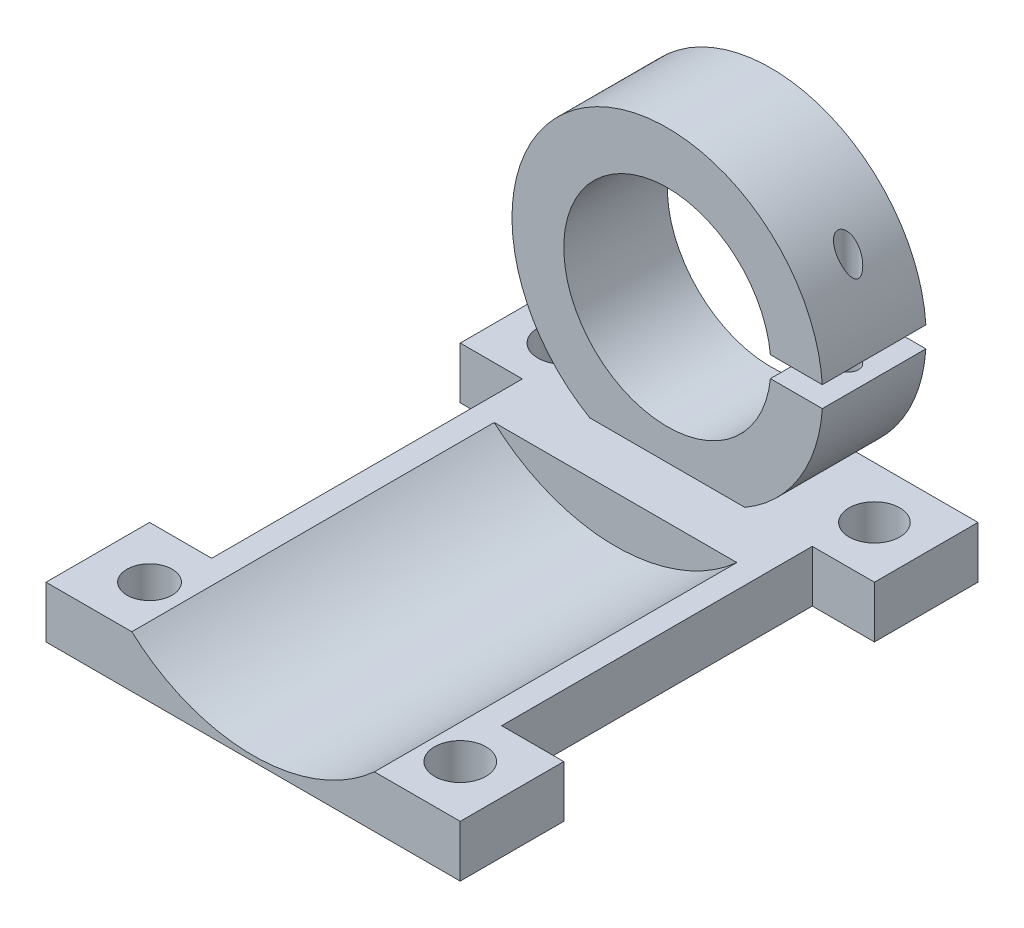
ISO-10303-21;
HEADER;
FILE_DESCRIPTION(('STEP AP214'),'2;1');
FILE_NAME('part.step','',(''),(''),'','','');
FILE_SCHEMA(('AUTOMOTIVE_DESIGN { 1 0 10303 214 1 1 1 1 }'));
ENDSEC;
DATA;
#1=APPLICATION_CONTEXT('core data for automotive mechanical design processes');
#2=APPLICATION_PROTOCOL_DEFINITION('international standard','automotive_design',2000,#1);
#3=PRODUCT_CONTEXT('',#1,'mechanical');
#4=PRODUCT('Part','Part','',(#3));
#5=PRODUCT_RELATED_PRODUCT_CATEGORY('part','',(#4));
#6=PRODUCT_DEFINITION_FORMATION('','',#4);
#7=PRODUCT_DEFINITION_CONTEXT('part definition',#1,'design');
#8=PRODUCT_DEFINITION('design','',#6,#7);
#9=PRODUCT_DEFINITION_SHAPE('','',#8);
#10=(LENGTH_UNIT() NAMED_UNIT(*) SI_UNIT(.MILLI.,.METRE.));
#11=(NAMED_UNIT(*) PLANE_ANGLE_UNIT() SI_UNIT($,.RADIAN.));
#12=(NAMED_UNIT(*) SI_UNIT($,.STERADIAN.) SOLID_ANGLE_UNIT());
#13=UNCERTAINTY_MEASURE_WITH_UNIT(LENGTH_MEASURE(1.E-05),#10,'distance_accuracy_value','');
#14=(GEOMETRIC_REPRESENTATION_CONTEXT(3) GLOBAL_UNCERTAINTY_ASSIGNED_CONTEXT((#13)) GLOBAL_UNIT_ASSIGNED_CONTEXT((#10,
#11,#12)) REPRESENTATION_CONTEXT('',''));
#15=CARTESIAN_POINT('',(0.,0.,0.));
#16=DIRECTION('',(0.,0.,1.));
#17=DIRECTION('',(1.,0.,0.));
#18=AXIS2_PLACEMENT_3D('',#15,#16,#17);
#19=CARTESIAN_POINT('',(-20.,5.,0.));
#20=DIRECTION('',(-1.,0.,0.));
#21=DIRECTION('',(0.,0.,1.));
#22=AXIS2_PLACEMENT_3D('',#19,#20,#21);
#23=PLANE('',#22);
#24=DIRECTION('',(0.,0.,-1.));
#25=VECTOR('',#24,1.);
#26=CARTESIAN_POINT('',(-20.,0.,0.));
#27=LINE('',#26,#25);
#28=CARTESIAN_POINT('',(-20.,0.,25.));
#29=VERTEX_POINT('',#28);
#30=CARTESIAN_POINT('',(-20.,0.,15.));
#31=VERTEX_POINT('',#30);
#32=EDGE_CURVE('E253',#29,#31,#27,.T.);
#33=ORIENTED_EDGE('',*,*,#32,.F.);
#34=DIRECTION('',(0.,-1.,0.));
#35=VECTOR('',#34,1.);
#36=CARTESIAN_POINT('',(-20.,5.,25.));
#37=LINE('',#36,#35);
#38=CARTESIAN_POINT('',(-20.,5.,25.));
#39=VERTEX_POINT('',#38);
#40=EDGE_CURVE('E333',#39,#29,#37,.T.);
#41=ORIENTED_EDGE('',*,*,#40,.F.);
#42=DIRECTION('',(0.,0.,-1.));
#43=VECTOR('',#42,1.);
#44=CARTESIAN_POINT('',(-20.,5.,0.));
#45=LINE('',#44,#43);
#46=CARTESIAN_POINT('',(-20.,5.,15.));
#47=VERTEX_POINT('',#46);
#48=EDGE_CURVE('E208',#39,#47,#45,.T.);
#49=ORIENTED_EDGE('',*,*,#48,.T.);
#50=DIRECTION('',(0.,-1.,0.));
#51=VECTOR('',#50,1.);
#52=CARTESIAN_POINT('',(-20.,5.,15.));
#53=LINE('',#52,#51);
#54=EDGE_CURVE('E252',#47,#31,#53,.T.);
#55=ORIENTED_EDGE('',*,*,#54,.T.);
#56=EDGE_LOOP('',(#33,#41,#49,#55));
#57=FACE_BOUND('',#56,.T.);
#58=ADVANCED_FACE('F51',(#57),#23,.T.);
#59=CARTESIAN_POINT('',(0.,5.,25.));
#60=DIRECTION('',(0.,0.,1.));
#61=DIRECTION('',(1.,0.,0.));
#62=AXIS2_PLACEMENT_3D('',#59,#60,#61);
#63=PLANE('',#62);
#64=CARTESIAN_POINT('',(0.,18.,25.));
#65=DIRECTION('',(0.,0.,1.));
#66=DIRECTION('',(1.,0.,0.));
#67=AXIS2_PLACEMENT_3D('',#64,#65,#66);
#68=CIRCLE('',#67,17.5);
#69=CARTESIAN_POINT('',(-11.71537451386,5.,25.));
#70=VERTEX_POINT('',#69);
#71=CARTESIAN_POINT('',(11.71537451386,5.,25.));
#72=VERTEX_POINT('',#71);
#73=EDGE_CURVE('E191',#70,#72,#68,.T.);
#74=ORIENTED_EDGE('',*,*,#73,.F.);
#75=DIRECTION('',(-1.,0.,0.));
#76=VECTOR('',#75,1.);
#77=CARTESIAN_POINT('',(0.,5.,25.));
#78=LINE('',#77,#76);
#79=EDGE_CURVE('E198',#70,#39,#78,.T.);
#80=ORIENTED_EDGE('',*,*,#79,.T.);
#81=ORIENTED_EDGE('',*,*,#40,.T.);
#82=DIRECTION('',(-1.,0.,0.));
#83=VECTOR('',#82,1.);
#84=CARTESIAN_POINT('',(0.,0.,25.));
#85=LINE('',#84,#83);
#86=CARTESIAN_POINT('',(20.,0.,25.));
#87=VERTEX_POINT('',#86);
#88=EDGE_CURVE('E257',#87,#29,#85,.T.);
#89=ORIENTED_EDGE('',*,*,#88,.F.);
#90=DIRECTION('',(0.,-1.,0.));
#91=VECTOR('',#90,1.);
#92=CARTESIAN_POINT('',(20.,5.,25.));
#93=LINE('',#92,#91);
#94=CARTESIAN_POINT('',(20.,5.,25.));
#95=VERTEX_POINT('',#94);
#96=EDGE_CURVE('E330',#95,#87,#93,.T.);
#97=ORIENTED_EDGE('',*,*,#96,.F.);
#98=EDGE_CURVE('E201',#95,#72,#78,.T.);
#99=ORIENTED_EDGE('',*,*,#98,.T.);
#100=EDGE_LOOP('',(#74,#80,#81,#89,#97,#99));
#101=FACE_BOUND('',#100,.T.);
#102=ADVANCED_FACE('F197',(#101),#63,.T.);
#103=CARTESIAN_POINT('',(20.,5.,0.));
#104=DIRECTION('',(-1.,0.,0.));
#105=DIRECTION('',(0.,0.,1.));
#106=AXIS2_PLACEMENT_3D('',#103,#104,#105);
#107=PLANE('',#106);
#108=DIRECTION('',(0.,0.,-1.));
#109=VECTOR('',#108,1.);
#110=CARTESIAN_POINT('',(20.,0.,0.));
#111=LINE('',#110,#109);
#112=CARTESIAN_POINT('',(20.,0.,15.));
#113=VERTEX_POINT('',#112);
#114=EDGE_CURVE('E262',#87,#113,#111,.T.);
#115=ORIENTED_EDGE('',*,*,#114,.T.);
#116=DIRECTION('',(0.,-1.,0.));
#117=VECTOR('',#116,1.);
#118=CARTESIAN_POINT('',(20.,5.,15.));
#119=LINE('',#118,#117);
#120=CARTESIAN_POINT('',(20.,5.,15.));
#121=VERTEX_POINT('',#120);
#122=EDGE_CURVE('E327',#121,#113,#119,.T.);
#123=ORIENTED_EDGE('',*,*,#122,.F.);
#124=DIRECTION('',(0.,0.,-1.));
#125=VECTOR('',#124,1.);
#126=CARTESIAN_POINT('',(20.,5.,0.));
#127=LINE('',#126,#125);
#128=EDGE_CURVE('E213',#95,#121,#127,.T.);
#129=ORIENTED_EDGE('',*,*,#128,.F.);
#130=ORIENTED_EDGE('',*,*,#96,.T.);
#131=EDGE_LOOP('',(#115,#123,#129,#130));
#132=FACE_BOUND('',#131,.T.);
#133=ADVANCED_FACE('F433',(#132),#107,.F.);
#134=CARTESIAN_POINT('',(0.,5.,15.));
#135=DIRECTION('',(0.,0.,-1.));
#136=DIRECTION('',(-1.,0.,0.));
#137=AXIS2_PLACEMENT_3D('',#134,#135,#136);
#138=PLANE('',#137);
#139=DIRECTION('',(1.,0.,0.));
#140=VECTOR('',#139,1.);
#141=CARTESIAN_POINT('',(0.,0.,15.));
#142=LINE('',#141,#140);
#143=CARTESIAN_POINT('',(14.,0.,15.));
#144=VERTEX_POINT('',#143);
#145=EDGE_CURVE('E266',#144,#113,#142,.T.);
#146=ORIENTED_EDGE('',*,*,#145,.F.);
#147=DIRECTION('',(0.,-1.,0.));
#148=VECTOR('',#147,1.);
#149=CARTESIAN_POINT('',(14.,5.,15.));
#150=LINE('',#149,#148);
#151=CARTESIAN_POINT('',(14.,5.,15.));
#152=VERTEX_POINT('',#151);
#153=EDGE_CURVE('E324',#152,#144,#150,.T.);
#154=ORIENTED_EDGE('',*,*,#153,.F.);
#155=DIRECTION('',(1.,0.,0.));
#156=VECTOR('',#155,1.);
#157=CARTESIAN_POINT('',(0.,5.,15.));
#158=LINE('',#157,#156);
#159=EDGE_CURVE('E220',#152,#121,#158,.T.);
#160=ORIENTED_EDGE('',*,*,#159,.T.);
#161=ORIENTED_EDGE('',*,*,#122,.T.);
#162=EDGE_LOOP('',(#146,#154,#160,#161));
#163=FACE_BOUND('',#162,.T.);
#164=ADVANCED_FACE('F449',(#163),#138,.T.);
#165=CARTESIAN_POINT('',(14.,5.,0.));
#166=DIRECTION('',(-1.,0.,0.));
#167=DIRECTION('',(0.,0.,1.));
#168=AXIS2_PLACEMENT_3D('',#165,#166,#167);
#169=PLANE('',#168);
#170=DIRECTION('',(0.,0.,-1.));
#171=VECTOR('',#170,1.);
#172=CARTESIAN_POINT('',(14.,0.,0.));
#173=LINE('',#172,#171);
#174=CARTESIAN_POINT('',(14.,0.,-15.));
#175=VERTEX_POINT('',#174);
#176=EDGE_CURVE('E270',#144,#175,#173,.T.);
#177=ORIENTED_EDGE('',*,*,#176,.T.);
#178=DIRECTION('',(0.,-1.,0.));
#179=VECTOR('',#178,1.);
#180=CARTESIAN_POINT('',(14.,5.,-15.));
#181=LINE('',#180,#179);
#182=CARTESIAN_POINT('',(14.,5.,-15.));
#183=VERTEX_POINT('',#182);
#184=EDGE_CURVE('E320',#183,#175,#181,.T.);
#185=ORIENTED_EDGE('',*,*,#184,.F.);
#186=DIRECTION('',(0.,0.,-1.));
#187=VECTOR('',#186,1.);
#188=CARTESIAN_POINT('',(14.,5.,0.));
#189=LINE('',#188,#187);
#190=EDGE_CURVE('E224',#152,#183,#189,.T.);
#191=ORIENTED_EDGE('',*,*,#190,.F.);
#192=ORIENTED_EDGE('',*,*,#153,.T.);
#193=EDGE_LOOP('',(#177,#185,#191,#192));
#194=FACE_BOUND('',#193,.T.);
#195=ADVANCED_FACE('F452',(#194),#169,.F.);
#196=CARTESIAN_POINT('',(0.,5.,-15.));
#197=DIRECTION('',(0.,0.,-1.));
#198=DIRECTION('',(-1.,0.,0.));
#199=AXIS2_PLACEMENT_3D('',#196,#197,#198);
#200=PLANE('',#199);
#201=DIRECTION('',(1.,0.,0.));
#202=VECTOR('',#201,1.);
#203=CARTESIAN_POINT('',(0.,0.,-15.));
#204=LINE('',#203,#202);
#205=CARTESIAN_POINT('',(20.,0.,-15.));
#206=VERTEX_POINT('',#205);
#207=EDGE_CURVE('E273',#175,#206,#204,.T.);
#208=ORIENTED_EDGE('',*,*,#207,.T.);
#209=DIRECTION('',(0.,-1.,0.));
#210=VECTOR('',#209,1.);
#211=CARTESIAN_POINT('',(20.,5.,-15.));
#212=LINE('',#211,#210);
#213=CARTESIAN_POINT('',(20.,5.,-15.));
#214=VERTEX_POINT('',#213);
#215=EDGE_CURVE('E317',#214,#206,#212,.T.);
#216=ORIENTED_EDGE('',*,*,#215,.F.);
#217=DIRECTION('',(1.,0.,0.));
#218=VECTOR('',#217,1.);
#219=CARTESIAN_POINT('',(0.,5.,-15.));
#220=LINE('',#219,#218);
#221=EDGE_CURVE('E227',#183,#214,#220,.T.);
#222=ORIENTED_EDGE('',*,*,#221,.F.);
#223=ORIENTED_EDGE('',*,*,#184,.T.);
#224=EDGE_LOOP('',(#208,#216,#222,#223));
#225=FACE_BOUND('',#224,.T.);
#226=ADVANCED_FACE('F457',(#225),#200,.F.);
#227=CARTESIAN_POINT('',(20.,5.,0.));
#228=DIRECTION('',(1.,0.,0.));
#229=DIRECTION('',(0.,0.,-1.));
#230=AXIS2_PLACEMENT_3D('',#227,#228,#229);
#231=PLANE('',#230);
#232=DIRECTION('',(0.,0.,1.));
#233=VECTOR('',#232,1.);
#234=CARTESIAN_POINT('',(20.,0.,0.));
#235=LINE('',#234,#233);
#236=CARTESIAN_POINT('',(20.,0.,-25.));
#237=VERTEX_POINT('',#236);
#238=EDGE_CURVE('E277',#237,#206,#235,.T.);
#239=ORIENTED_EDGE('',*,*,#238,.F.);
#240=DIRECTION('',(0.,-1.,0.));
#241=VECTOR('',#240,1.);
#242=CARTESIAN_POINT('',(20.,5.,-25.));
#243=LINE('',#242,#241);
#244=CARTESIAN_POINT('',(20.,5.,-25.));
#245=VERTEX_POINT('',#244);
#246=EDGE_CURVE('E314',#245,#237,#243,.T.);
#247=ORIENTED_EDGE('',*,*,#246,.F.);
#248=DIRECTION('',(0.,0.,1.));
#249=VECTOR('',#248,1.);
#250=CARTESIAN_POINT('',(20.,5.,0.));
#251=LINE('',#250,#249);
#252=EDGE_CURVE('E230',#245,#214,#251,.T.);
#253=ORIENTED_EDGE('',*,*,#252,.T.);
#254=ORIENTED_EDGE('',*,*,#215,.T.);
#255=EDGE_LOOP('',(#239,#247,#253,#254));
#256=FACE_BOUND('',#255,.T.);
#257=ADVANCED_FACE('F462',(#256),#231,.T.);
#258=CARTESIAN_POINT('',(0.,5.,-25.));
#259=DIRECTION('',(0.,0.,1.));
#260=DIRECTION('',(1.,0.,0.));
#261=AXIS2_PLACEMENT_3D('',#258,#259,#260);
#262=PLANE('',#261);
#263=DIRECTION('',(-1.,0.,0.));
#264=VECTOR('',#263,1.);
#265=CARTESIAN_POINT('',(0.,5.,-25.));
#266=LINE('',#265,#264);
#267=CARTESIAN_POINT('',(-7.48331477354789,5.,-25.));
#268=VERTEX_POINT('',#267);
#269=CARTESIAN_POINT('',(-20.,5.,-25.));
#270=VERTEX_POINT('',#269);
#271=EDGE_CURVE('E234',#268,#270,#266,.T.);
#272=ORIENTED_EDGE('',*,*,#271,.F.);
#273=CARTESIAN_POINT('',(0.,18.,-25.));
#274=DIRECTION('',(0.,0.,-1.));
#275=DIRECTION('',(-1.,0.,0.));
#276=AXIS2_PLACEMENT_3D('',#273,#274,#275);
#277=CIRCLE('',#276,15.);
#278=CARTESIAN_POINT('',(14.9666295470958,19.,-25.));
#279=VERTEX_POINT('',#278);
#280=EDGE_CURVE('E476',#268,#279,#277,.T.);
#281=ORIENTED_EDGE('',*,*,#280,.T.);
#282=DIRECTION('',(-1.,0.,0.));
#283=VECTOR('',#282,1.);
#284=CARTESIAN_POINT('',(9.9498743710662,19.,-25.));
#285=LINE('',#284,#283);
#286=CARTESIAN_POINT('',(9.9498743710662,19.,-25.));
#287=VERTEX_POINT('',#286);
#288=EDGE_CURVE('E475',#279,#287,#285,.T.);
#289=ORIENTED_EDGE('',*,*,#288,.T.);
#290=CARTESIAN_POINT('',(0.,18.,-25.));
#291=DIRECTION('',(0.,0.,1.));
#292=DIRECTION('',(-1.,0.,0.));
#293=AXIS2_PLACEMENT_3D('',#290,#291,#292);
#294=CIRCLE('',#293,10.);
#295=CARTESIAN_POINT('',(9.9498743710662,17.,-25.));
#296=VERTEX_POINT('',#295);
#297=EDGE_CURVE('E481',#287,#296,#294,.T.);
#298=ORIENTED_EDGE('',*,*,#297,.T.);
#299=DIRECTION('',(1.,0.,0.));
#300=VECTOR('',#299,1.);
#301=CARTESIAN_POINT('',(9.9498743710662,17.,-25.));
#302=LINE('',#301,#300);
#303=CARTESIAN_POINT('',(14.9666295470958,17.,-25.));
#304=VERTEX_POINT('',#303);
#305=EDGE_CURVE('E472',#296,#304,#302,.T.);
#306=ORIENTED_EDGE('',*,*,#305,.T.);
#307=CARTESIAN_POINT('',(7.48331477354788,5.,-25.));
#308=VERTEX_POINT('',#307);
#309=EDGE_CURVE('E469',#304,#308,#277,.T.);
#310=ORIENTED_EDGE('',*,*,#309,.T.);
#311=EDGE_CURVE('E235',#245,#308,#266,.T.);
#312=ORIENTED_EDGE('',*,*,#311,.F.);
#313=ORIENTED_EDGE('',*,*,#246,.T.);
#314=DIRECTION('',(-1.,0.,0.));
#315=VECTOR('',#314,1.);
#316=CARTESIAN_POINT('',(0.,0.,-25.));
#317=LINE('',#316,#315);
#318=CARTESIAN_POINT('',(-20.,0.,-25.));
#319=VERTEX_POINT('',#318);
#320=EDGE_CURVE('E281',#237,#319,#317,.T.);
#321=ORIENTED_EDGE('',*,*,#320,.T.);
#322=DIRECTION('',(0.,-1.,0.));
#323=VECTOR('',#322,1.);
#324=CARTESIAN_POINT('',(-20.,5.,-25.));
#325=LINE('',#324,#323);
#326=EDGE_CURVE('E310',#270,#319,#325,.T.);
#327=ORIENTED_EDGE('',*,*,#326,.F.);
#328=EDGE_LOOP('',(#272,#281,#289,#298,#306,#310,#312,#313,#321,#327));
#329=FACE_BOUND('',#328,.T.);
#330=ADVANCED_FACE('F466',(#329),#262,.F.);
#331=CARTESIAN_POINT('',(-20.,5.,0.));
#332=DIRECTION('',(1.,0.,0.));
#333=DIRECTION('',(0.,0.,-1.));
#334=AXIS2_PLACEMENT_3D('',#331,#332,#333);
#335=PLANE('',#334);
#336=DIRECTION('',(0.,0.,1.));
#337=VECTOR('',#336,1.);
#338=CARTESIAN_POINT('',(-20.,0.,0.));
#339=LINE('',#338,#337);
#340=CARTESIAN_POINT('',(-20.,0.,-15.));
#341=VERTEX_POINT('',#340);
#342=EDGE_CURVE('E284',#319,#341,#339,.T.);
#343=ORIENTED_EDGE('',*,*,#342,.T.);
#344=DIRECTION('',(0.,-1.,0.));
#345=VECTOR('',#344,1.);
#346=CARTESIAN_POINT('',(-20.,5.,-15.));
#347=LINE('',#346,#345);
#348=CARTESIAN_POINT('',(-20.,5.,-15.));
#349=VERTEX_POINT('',#348);
#350=EDGE_CURVE('E307',#349,#341,#347,.T.);
#351=ORIENTED_EDGE('',*,*,#350,.F.);
#352=DIRECTION('',(0.,0.,1.));
#353=VECTOR('',#352,1.);
#354=CARTESIAN_POINT('',(-20.,5.,0.));
#355=LINE('',#354,#353);
#356=EDGE_CURVE('E238',#270,#349,#355,.T.);
#357=ORIENTED_EDGE('',*,*,#356,.F.);
#358=ORIENTED_EDGE('',*,*,#326,.T.);
#359=EDGE_LOOP('',(#343,#351,#357,#358));
#360=FACE_BOUND('',#359,.T.);
#361=ADVANCED_FACE('F534',(#360),#335,.F.);
#362=CARTESIAN_POINT('',(0.,5.,-15.));
#363=DIRECTION('',(0.,0.,1.));
#364=DIRECTION('',(1.,0.,0.));
#365=AXIS2_PLACEMENT_3D('',#362,#363,#364);
#366=PLANE('',#365);
#367=DIRECTION('',(-1.,0.,0.));
#368=VECTOR('',#367,1.);
#369=CARTESIAN_POINT('',(0.,0.,-15.));
#370=LINE('',#369,#368);
#371=CARTESIAN_POINT('',(-14.,0.,-15.));
#372=VERTEX_POINT('',#371);
#373=EDGE_CURVE('E288',#372,#341,#370,.T.);
#374=ORIENTED_EDGE('',*,*,#373,.F.);
#375=DIRECTION('',(0.,-1.,0.));
#376=VECTOR('',#375,1.);
#377=CARTESIAN_POINT('',(-14.,5.,-15.));
#378=LINE('',#377,#376);
#379=CARTESIAN_POINT('',(-14.,5.,-15.));
#380=VERTEX_POINT('',#379);
#381=EDGE_CURVE('E304',#380,#372,#378,.T.);
#382=ORIENTED_EDGE('',*,*,#381,.F.);
#383=DIRECTION('',(-1.,0.,0.));
#384=VECTOR('',#383,1.);
#385=CARTESIAN_POINT('',(0.,5.,-15.));
#386=LINE('',#385,#384);
#387=EDGE_CURVE('E241',#380,#349,#386,.T.);
#388=ORIENTED_EDGE('',*,*,#387,.T.);
#389=ORIENTED_EDGE('',*,*,#350,.T.);
#390=EDGE_LOOP('',(#374,#382,#388,#389));
#391=FACE_BOUND('',#390,.T.);
#392=ADVANCED_FACE('F538',(#391),#366,.T.);
#393=CARTESIAN_POINT('',(-14.,5.,0.));
#394=DIRECTION('',(-1.,0.,0.));
#395=DIRECTION('',(0.,0.,1.));
#396=AXIS2_PLACEMENT_3D('',#393,#394,#395);
#397=PLANE('',#396);
#398=DIRECTION('',(0.,0.,-1.));
#399=VECTOR('',#398,1.);
#400=CARTESIAN_POINT('',(-14.,0.,0.));
#401=LINE('',#400,#399);
#402=CARTESIAN_POINT('',(-14.,0.,15.));
#403=VERTEX_POINT('',#402);
#404=EDGE_CURVE('E292',#403,#372,#401,.T.);
#405=ORIENTED_EDGE('',*,*,#404,.F.);
#406=DIRECTION('',(0.,-1.,0.));
#407=VECTOR('',#406,1.);
#408=CARTESIAN_POINT('',(-14.,5.,15.));
#409=LINE('',#408,#407);
#410=CARTESIAN_POINT('',(-14.,5.,15.));
#411=VERTEX_POINT('',#410);
#412=EDGE_CURVE('E301',#411,#403,#409,.T.);
#413=ORIENTED_EDGE('',*,*,#412,.F.);
#414=DIRECTION('',(0.,0.,-1.));
#415=VECTOR('',#414,1.);
#416=CARTESIAN_POINT('',(-14.,5.,0.));
#417=LINE('',#416,#415);
#418=EDGE_CURVE('E245',#411,#380,#417,.T.);
#419=ORIENTED_EDGE('',*,*,#418,.T.);
#420=ORIENTED_EDGE('',*,*,#381,.T.);
#421=EDGE_LOOP('',(#405,#413,#419,#420));
#422=FACE_BOUND('',#421,.T.);
#423=ADVANCED_FACE('F541',(#422),#397,.T.);
#424=CARTESIAN_POINT('',(0.,5.,15.));
#425=DIRECTION('',(0.,0.,1.));
#426=DIRECTION('',(1.,0.,0.));
#427=AXIS2_PLACEMENT_3D('',#424,#425,#426);
#428=PLANE('',#427);
#429=DIRECTION('',(-1.,0.,0.));
#430=VECTOR('',#429,1.);
#431=CARTESIAN_POINT('',(0.,0.,15.));
#432=LINE('',#431,#430);
#433=EDGE_CURVE('E214',#403,#31,#432,.T.);
#434=ORIENTED_EDGE('',*,*,#433,.T.);
#435=ORIENTED_EDGE('',*,*,#54,.F.);
#436=DIRECTION('',(-1.,0.,0.));
#437=VECTOR('',#436,1.);
#438=CARTESIAN_POINT('',(0.,5.,15.));
#439=LINE('',#438,#437);
#440=EDGE_CURVE('E249',#411,#47,#439,.T.);
#441=ORIENTED_EDGE('',*,*,#440,.F.);
#442=ORIENTED_EDGE('',*,*,#412,.T.);
#443=EDGE_LOOP('',(#434,#435,#441,#442));
#444=FACE_BOUND('',#443,.T.);
#445=ADVANCED_FACE('F544',(#444),#428,.F.);
#446=CARTESIAN_POINT('',(0.,5.,0.));
#447=DIRECTION('',(0.,1.,0.));
#448=DIRECTION('',(0.,0.,1.));
#449=AXIS2_PLACEMENT_3D('',#446,#447,#448);
#450=PLANE('',#449);
#451=CARTESIAN_POINT('',(-15.,5.,-20.));
#452=DIRECTION('',(0.,1.,0.));
#453=DIRECTION('',(0.,0.,1.));
#454=AXIS2_PLACEMENT_3D('',#451,#452,#453);
#455=CIRCLE('',#454,2.51154590945259);
#456=CARTESIAN_POINT('',(-15.,5.,-17.4884540905474));
#457=VERTEX_POINT('',#456);
#458=EDGE_CURVE('E765',#457,#457,#455,.T.);
#459=ORIENTED_EDGE('',*,*,#458,.F.);
#460=EDGE_LOOP('',(#459));
#461=FACE_BOUND('',#460,.T.);
#462=CARTESIAN_POINT('',(15.,5.,-20.));
#463=DIRECTION('',(0.,1.,0.));
#464=DIRECTION('',(0.,0.,1.));
#465=AXIS2_PLACEMENT_3D('',#462,#463,#464);
#466=CIRCLE('',#465,2.44621489219867);
#467=CARTESIAN_POINT('',(15.,5.,-17.5537851078013));
#468=VERTEX_POINT('',#467);
#469=EDGE_CURVE('E767',#468,#468,#466,.T.);
#470=ORIENTED_EDGE('',*,*,#469,.F.);
#471=EDGE_LOOP('',(#470));
#472=FACE_BOUND('',#471,.T.);
#473=CARTESIAN_POINT('',(15.,5.,20.));
#474=DIRECTION('',(0.,1.,0.));
#475=DIRECTION('',(0.,0.,1.));
#476=AXIS2_PLACEMENT_3D('',#473,#474,#475);
#477=CIRCLE('',#476,2.48218960949885);
#478=CARTESIAN_POINT('',(15.,5.,22.4821896094988));
#479=VERTEX_POINT('',#478);
#480=EDGE_CURVE('E770',#479,#479,#477,.T.);
#481=ORIENTED_EDGE('',*,*,#480,.F.);
#482=EDGE_LOOP('',(#481));
#483=FACE_BOUND('',#482,.T.);
#484=CARTESIAN_POINT('',(-15.,5.,20.));
#485=DIRECTION('',(0.,1.,0.));
#486=DIRECTION('',(0.,0.,1.));
#487=AXIS2_PLACEMENT_3D('',#484,#485,#486);
#488=CIRCLE('',#487,2.17995769923761);
#489=CARTESIAN_POINT('',(-15.,5.,22.1799576992376));
#490=VERTEX_POINT('',#489);
#491=EDGE_CURVE('E361',#490,#490,#488,.T.);
#492=ORIENTED_EDGE('',*,*,#491,.F.);
#493=EDGE_LOOP('',(#492));
#494=FACE_BOUND('',#493,.T.);
#495=DIRECTION('',(0.,0.,1.));
#496=VECTOR('',#495,1.);
#497=CARTESIAN_POINT('',(-11.71537451386,5.,-10.));
#498=LINE('',#497,#496);
#499=CARTESIAN_POINT('',(-11.71537451386,5.,-10.));
#500=VERTEX_POINT('',#499);
#501=EDGE_CURVE('E13',#500,#70,#498,.T.);
#502=ORIENTED_EDGE('',*,*,#501,.F.);
#503=DIRECTION('',(1.,0.,0.));
#504=VECTOR('',#503,1.);
#505=CARTESIAN_POINT('',(0.,5.,-10.));
#506=LINE('',#505,#504);
#507=CARTESIAN_POINT('',(11.71537451386,5.,-10.));
#508=VERTEX_POINT('',#507);
#509=EDGE_CURVE('E345',#500,#508,#506,.T.);
#510=ORIENTED_EDGE('',*,*,#509,.T.);
#511=DIRECTION('',(0.,0.,1.));
#512=VECTOR('',#511,1.);
#513=CARTESIAN_POINT('',(11.71537451386,5.,-10.));
#514=LINE('',#513,#512);
#515=EDGE_CURVE('E60',#72,#508,#514,.F.);
#516=ORIENTED_EDGE('',*,*,#515,.F.);
#517=ORIENTED_EDGE('',*,*,#98,.F.);
#518=ORIENTED_EDGE('',*,*,#128,.T.);
#519=ORIENTED_EDGE('',*,*,#159,.F.);
#520=ORIENTED_EDGE('',*,*,#190,.T.);
#521=ORIENTED_EDGE('',*,*,#221,.T.);
#522=ORIENTED_EDGE('',*,*,#252,.F.);
#523=ORIENTED_EDGE('',*,*,#311,.T.);
#524=DIRECTION('',(0.,0.,-1.));
#525=VECTOR('',#524,1.);
#526=CARTESIAN_POINT('',(7.48331477354789,5.,-15.));
#527=LINE('',#526,#525);
#528=CARTESIAN_POINT('',(7.48331477354789,5.,-15.));
#529=VERTEX_POINT('',#528);
#530=EDGE_CURVE('E341',#529,#308,#527,.T.);
#531=ORIENTED_EDGE('',*,*,#530,.F.);
#532=DIRECTION('',(-1.,0.,0.));
#533=VECTOR('',#532,1.);
#534=CARTESIAN_POINT('',(0.,5.,-15.));
#535=LINE('',#534,#533);
#536=CARTESIAN_POINT('',(-7.48331477354789,5.,-15.));
#537=VERTEX_POINT('',#536);
#538=EDGE_CURVE('E75',#529,#537,#535,.T.);
#539=ORIENTED_EDGE('',*,*,#538,.T.);
#540=DIRECTION('',(0.,0.,-1.));
#541=VECTOR('',#540,1.);
#542=CARTESIAN_POINT('',(-7.48331477354789,5.,-15.));
#543=LINE('',#542,#541);
#544=EDGE_CURVE('E338',#268,#537,#543,.F.);
#545=ORIENTED_EDGE('',*,*,#544,.F.);
#546=ORIENTED_EDGE('',*,*,#271,.T.);
#547=ORIENTED_EDGE('',*,*,#356,.T.);
#548=ORIENTED_EDGE('',*,*,#387,.F.);
#549=ORIENTED_EDGE('',*,*,#418,.F.);
#550=ORIENTED_EDGE('',*,*,#440,.T.);
#551=ORIENTED_EDGE('',*,*,#48,.F.);
#552=ORIENTED_EDGE('',*,*,#79,.F.);
#553=EDGE_LOOP('',(#502,#510,#516,#517,#518,#519,#520,#521,#522,#523,#531,#539,#545,#546,#547,
#548,#549,#550,#551,#552));
#554=FACE_BOUND('',#553,.T.);
#555=ADVANCED_FACE('F206',(#461,#472,#483,#494,#554),#450,.T.);
#556=CARTESIAN_POINT('',(0.,0.,0.));
#557=DIRECTION('',(0.,1.,0.));
#558=DIRECTION('',(0.,0.,1.));
#559=AXIS2_PLACEMENT_3D('',#556,#557,#558);
#560=PLANE('',#559);
#561=CARTESIAN_POINT('',(-15.,0.,-20.));
#562=DIRECTION('',(0.,1.,0.));
#563=DIRECTION('',(0.,0.,1.));
#564=AXIS2_PLACEMENT_3D('',#561,#562,#563);
#565=CIRCLE('',#564,2.51154590945259);
#566=CARTESIAN_POINT('',(-15.,0.,-17.4884540905474));
#567=VERTEX_POINT('',#566);
#568=EDGE_CURVE('E54',#567,#567,#565,.T.);
#569=ORIENTED_EDGE('',*,*,#568,.T.);
#570=EDGE_LOOP('',(#569));
#571=FACE_BOUND('',#570,.T.);
#572=CARTESIAN_POINT('',(15.,0.,-20.));
#573=DIRECTION('',(0.,1.,0.));
#574=DIRECTION('',(0.,0.,1.));
#575=AXIS2_PLACEMENT_3D('',#572,#573,#574);
#576=CIRCLE('',#575,2.44621489219867);
#577=CARTESIAN_POINT('',(15.,0.,-17.5537851078013));
#578=VERTEX_POINT('',#577);
#579=EDGE_CURVE('E364',#578,#578,#576,.T.);
#580=ORIENTED_EDGE('',*,*,#579,.T.);
#581=EDGE_LOOP('',(#580));
#582=FACE_BOUND('',#581,.T.);
#583=CARTESIAN_POINT('',(15.,0.,20.));
#584=DIRECTION('',(0.,1.,0.));
#585=DIRECTION('',(0.,0.,1.));
#586=AXIS2_PLACEMENT_3D('',#583,#584,#585);
#587=CIRCLE('',#586,2.48218960949885);
#588=CARTESIAN_POINT('',(15.,0.,22.4821896094988));
#589=VERTEX_POINT('',#588);
#590=EDGE_CURVE('E360',#589,#589,#587,.T.);
#591=ORIENTED_EDGE('',*,*,#590,.T.);
#592=EDGE_LOOP('',(#591));
#593=FACE_BOUND('',#592,.T.);
#594=CARTESIAN_POINT('',(-15.,0.,20.));
#595=DIRECTION('',(0.,1.,0.));
#596=DIRECTION('',(0.,0.,1.));
#597=AXIS2_PLACEMENT_3D('',#594,#595,#596);
#598=CIRCLE('',#597,2.17995769923761);
#599=CARTESIAN_POINT('',(-15.,0.,22.1799576992376));
#600=VERTEX_POINT('',#599);
#601=EDGE_CURVE('E356',#600,#600,#598,.T.);
#602=ORIENTED_EDGE('',*,*,#601,.T.);
#603=EDGE_LOOP('',(#602));
#604=FACE_BOUND('',#603,.T.);
#605=ORIENTED_EDGE('',*,*,#32,.T.);
#606=ORIENTED_EDGE('',*,*,#433,.F.);
#607=ORIENTED_EDGE('',*,*,#404,.T.);
#608=ORIENTED_EDGE('',*,*,#373,.T.);
#609=ORIENTED_EDGE('',*,*,#342,.F.);
#610=ORIENTED_EDGE('',*,*,#320,.F.);
#611=ORIENTED_EDGE('',*,*,#238,.T.);
#612=ORIENTED_EDGE('',*,*,#207,.F.);
#613=ORIENTED_EDGE('',*,*,#176,.F.);
#614=ORIENTED_EDGE('',*,*,#145,.T.);
#615=ORIENTED_EDGE('',*,*,#114,.F.);
#616=ORIENTED_EDGE('',*,*,#88,.T.);
#617=EDGE_LOOP('',(#605,#606,#607,#608,#609,#610,#611,#612,#613,#614,#615,#616));
#618=FACE_BOUND('',#617,.T.);
#619=ADVANCED_FACE('F440',(#571,#582,#593,#604,#618),#560,.F.);
#620=CARTESIAN_POINT('',(0.,18.,-15.));
#621=DIRECTION('',(0.,0.,-1.));
#622=DIRECTION('',(-1.,0.,0.));
#623=AXIS2_PLACEMENT_3D('',#620,#621,#622);
#624=CYLINDRICAL_SURFACE('',#623,15.);
#625=CARTESIAN_POINT('',(0.,18.,-15.));
#626=DIRECTION('',(0.,0.,-1.));
#627=DIRECTION('',(-1.,0.,0.));
#628=AXIS2_PLACEMENT_3D('',#625,#626,#627);
#629=CIRCLE('',#628,15.);
#630=CARTESIAN_POINT('',(14.9666295470958,17.,-15.));
#631=VERTEX_POINT('',#630);
#632=EDGE_CURVE('E517',#631,#529,#629,.T.);
#633=ORIENTED_EDGE('',*,*,#632,.T.);
#634=ORIENTED_EDGE('',*,*,#530,.T.);
#635=ORIENTED_EDGE('',*,*,#309,.F.);
#636=DIRECTION('',(0.,0.,-1.));
#637=VECTOR('',#636,1.);
#638=CARTESIAN_POINT('',(14.9666295470958,17.,-15.));
#639=LINE('',#638,#637);
#640=EDGE_CURVE('E258',#631,#304,#639,.T.);
#641=ORIENTED_EDGE('',*,*,#640,.F.);
#642=EDGE_LOOP('',(#633,#634,#635,#641));
#643=FACE_BOUND('',#642,.T.);
#644=ADVANCED_FACE('F640',(#643),#624,.T.);
#645=CARTESIAN_POINT('',(11.458251959081,27.6803131169512,-20.));
#646=CARTESIAN_POINT('',(11.4582548639243,27.6803099345785,-19.9580326759381));
#647=CARTESIAN_POINT('',(11.4609201844892,27.6771575236908,-19.916043135759));
#648=CARTESIAN_POINT('',(11.4713154117545,27.6648323054101,-19.8335986416699));
#649=CARTESIAN_POINT('',(11.4790508667421,27.6556529026141,-19.793145420331));
#650=CARTESIAN_POINT('',(11.4988039164673,27.6321201579899,-19.7152860723251));
#651=CARTESIAN_POINT('',(11.5107877472335,27.6178076017251,-19.6778586984249));
#652=CARTESIAN_POINT('',(11.5382003511069,27.584904384995,-19.6063308059268));
#653=CARTESIAN_POINT('',(11.5536306566363,27.5663118213769,-19.5722317769485));
#654=CARTESIAN_POINT('',(11.5948419043673,27.5163597763007,-19.4927034916424));
#655=CARTESIAN_POINT('',(11.6221199975474,27.4830606716373,-19.4492729359124));
#656=CARTESIAN_POINT('',(11.6803040078202,27.4113045084848,-19.3697333833955));
#657=CARTESIAN_POINT('',(11.7112183467524,27.3728354453898,-19.3336419334138));
#658=CARTESIAN_POINT('',(11.7923919523053,27.2706896636707,-19.2506114643641));
#659=CARTESIAN_POINT('',(11.8441496391118,27.2045407465472,-19.2082046478128));
#660=CARTESIAN_POINT('',(11.9497366160645,27.0670485963022,-19.1365824938413));
#661=CARTESIAN_POINT('',(12.0035697410462,26.9956955068691,-19.1073929840403));
#662=CARTESIAN_POINT('',(12.1004982736445,26.8647144758018,-19.065013538545));
#663=CARTESIAN_POINT('',(12.1435320168905,26.8056823575517,-19.0497701804432));
#664=CARTESIAN_POINT('',(12.2293353655353,26.686125312319,-19.0255326177172));
#665=CARTESIAN_POINT('',(12.2721047987187,26.6255995188338,-19.0165421331242));
#666=CARTESIAN_POINT('',(12.3570636422077,26.5034419586273,-19.0042059055321));
#667=CARTESIAN_POINT('',(12.3992519690272,26.4418085192763,-19.0008695795227));
#668=CARTESIAN_POINT('',(12.4827452023778,26.3178518819493,-18.9994281214499));
#669=CARTESIAN_POINT('',(12.5240496634795,26.2555283591406,-19.0013255671926));
#670=CARTESIAN_POINT('',(12.6076986793503,26.1272443140921,-19.0102895419281));
#671=CARTESIAN_POINT('',(12.6499844948573,26.0612641872309,-19.0176214608753));
#672=CARTESIAN_POINT('',(12.7331471302516,25.9292526556758,-19.0375755713627));
#673=CARTESIAN_POINT('',(12.774024467565,25.8632212791245,-19.0501957972459));
#674=CARTESIAN_POINT('',(12.8541072829508,25.7316132190036,-19.0806905520925));
#675=CARTESIAN_POINT('',(12.8933170478915,25.6660357844925,-19.0985505422045));
#676=CARTESIAN_POINT('',(12.9699764907205,25.5356104205381,-19.1397487409097));
#677=CARTESIAN_POINT('',(13.0074271290508,25.4707621080755,-19.1630839174545));
#678=CARTESIAN_POINT('',(13.075622658213,25.350661709212,-19.2123532581737));
#679=CARTESIAN_POINT('',(13.1066092486802,25.295251153756,-19.2375634659018));
#680=CARTESIAN_POINT('',(13.1668527715486,25.1859502280037,-19.2931970291649));
#681=CARTESIAN_POINT('',(13.1961069232983,25.1320623705106,-19.3236284754688));
#682=CARTESIAN_POINT('',(13.2526034505957,25.0265293610701,-19.3909363399794));
#683=CARTESIAN_POINT('',(13.2798268706371,24.9749068406359,-19.427864730723));
#684=CARTESIAN_POINT('',(13.3310517016983,24.8764881053839,-19.5095466864906));
#685=CARTESIAN_POINT('',(13.3550653561486,24.8296737184353,-19.5542689244529));
#686=CARTESIAN_POINT('',(13.3865478330865,24.7676320953287,-19.6273038201887));
#687=CARTESIAN_POINT('',(13.3960255944052,24.7488429491448,-19.6517011293228));
#688=CARTESIAN_POINT('',(13.4134999646293,24.7140445308508,-19.7029547228325));
#689=CARTESIAN_POINT('',(13.4214959887052,24.6980363565228,-19.7298119719034));
#690=CARTESIAN_POINT('',(13.4356085714196,24.6696835215626,-19.7863809966011));
#691=CARTESIAN_POINT('',(13.4416990499809,24.6573897699366,-19.8161256469495));
#692=CARTESIAN_POINT('',(13.4512273851431,24.6381172814992,-19.8776814877499));
#693=CARTESIAN_POINT('',(13.4546720686522,24.6311248663302,-19.9094871284738));
#694=CARTESIAN_POINT('',(13.4582465207762,24.6238671383934,-19.9707661547313));
#695=CARTESIAN_POINT('',(13.4586777274906,24.6229901243912,-20.0001478645095));
#696=CARTESIAN_POINT('',(13.4569652875853,24.6264687734021,-20.0585281281004));
#697=CARTESIAN_POINT('',(13.4548201933822,24.6308273782283,-20.087526457238));
#698=CARTESIAN_POINT('',(13.4480456127623,24.6445562809193,-20.1456453117518));
#699=CARTESIAN_POINT('',(13.4432882299676,24.654184489013,-20.1746878842211));
#700=CARTESIAN_POINT('',(13.431713607343,24.6775174369993,-20.2306340993606));
#701=CARTESIAN_POINT('',(13.4248930854139,24.6912286717401,-20.257534247024));
#702=CARTESIAN_POINT('',(13.4054849252834,24.7300565560403,-20.3232477657945));
#703=CARTESIAN_POINT('',(13.3917900386779,24.7572954473861,-20.3604612975815));
#704=CARTESIAN_POINT('',(13.3618832590996,24.8162437050869,-20.4299871162912));
#705=CARTESIAN_POINT('',(13.3456644634122,24.8479653088028,-20.4622854665515));
#706=CARTESIAN_POINT('',(13.3121822517815,24.9128199486046,-20.5214460427065));
#707=CARTESIAN_POINT('',(13.2949923366337,24.9458360250215,-20.5484807528519));
#708=CARTESIAN_POINT('',(13.2593514450864,25.0136348223561,-20.5993348170704));
#709=CARTESIAN_POINT('',(13.2408993431676,25.0484191127394,-20.6231512435152));
#710=CARTESIAN_POINT('',(13.1839684780068,25.1546773711628,-20.6905163878189));
#711=CARTESIAN_POINT('',(13.1439590177635,25.22797128655,-20.7299085058493));
#712=CARTESIAN_POINT('',(13.0639565949549,25.3715215615905,-20.7972698402036));
#713=CARTESIAN_POINT('',(13.0241715136375,25.4416144958085,-20.8258589517529));
#714=CARTESIAN_POINT('',(12.9423732548165,25.5829837611311,-20.8763203024552));
#715=CARTESIAN_POINT('',(12.9003583571794,25.6542609758253,-20.8981872650013));
#716=CARTESIAN_POINT('',(12.8142927494591,25.7974935699247,-20.935650533851));
#717=CARTESIAN_POINT('',(12.7702368335289,25.8694502632624,-20.9512296954228));
#718=CARTESIAN_POINT('',(12.6804148884048,26.0133809367795,-20.9761224064864));
#719=CARTESIAN_POINT('',(12.6346488473817,26.0853549170751,-20.9854359126293));
#720=CARTESIAN_POINT('',(12.5395979558645,26.2320380045868,-20.9978877736411));
#721=CARTESIAN_POINT('',(12.4902467488062,26.3067290675466,-21.0007382501694));
#722=CARTESIAN_POINT('',(12.3902163775765,26.4552086073093,-20.9989369890526));
#723=CARTESIAN_POINT('',(12.3395364800387,26.5289965512194,-20.9942810186792));
#724=CARTESIAN_POINT('',(12.2376366326322,26.6745659314597,-20.9767224540359));
#725=CARTESIAN_POINT('',(12.1864218214354,26.746356822096,-20.9638700398575));
#726=CARTESIAN_POINT('',(12.0838869468426,26.8874774846536,-20.9288612745906));
#727=CARTESIAN_POINT('',(12.0325671526882,26.9568107530376,-20.9067187682585));
#728=CARTESIAN_POINT('',(11.9413247678136,27.0779557567143,-20.8572609759616));
#729=CARTESIAN_POINT('',(11.901225949408,27.1304417338355,-20.8319417911062));
#730=CARTESIAN_POINT('',(11.8224463855695,27.2322206799549,-20.7734095163757));
#731=CARTESIAN_POINT('',(11.783767822814,27.28150881684,-20.7401848188401));
#732=CARTESIAN_POINT('',(11.7087883051619,27.3759242087302,-20.6642273016918));
#733=CARTESIAN_POINT('',(11.6725269275368,27.4209856185482,-20.6213710966258));
#734=CARTESIAN_POINT('',(11.6053940510478,27.5035591599379,-20.5253835379587));
#735=CARTESIAN_POINT('',(11.5745003552231,27.5411024843845,-20.4722965125795));
#736=CARTESIAN_POINT('',(11.5328014512345,27.591406291271,-20.3806518776571));
#737=CARTESIAN_POINT('',(11.5190359158643,27.6079215610773,-20.3454937419283));
#738=CARTESIAN_POINT('',(11.4952405336219,27.6363783619914,-20.2721879551406));
#739=CARTESIAN_POINT('',(11.4852050137013,27.648326839607,-20.2340449516792));
#740=CARTESIAN_POINT('',(11.4711549307513,27.6650245837723,-20.1633173975596));
#741=CARTESIAN_POINT('',(11.4663443348685,27.6707276304689,-20.13111525787));
#742=CARTESIAN_POINT('',(11.4598916134584,27.6783732592792,-20.0659466823133));
#743=CARTESIAN_POINT('',(11.4582496762974,27.6803156178323,-20.0329802011265));
#744=CARTESIAN_POINT('',(11.458251959081,27.6803131169512,-20.));
#745=B_SPLINE_CURVE_WITH_KNOTS('',3,(#645,#646,#647,#648,#649,#650,#651,#652,#653,#654,#655,
#656,#657,#658,#659,#660,#661,#662,#663,#664,#665,#666,#667,#668,#669,#670,#671,#672,#673,#674,
#675,#676,#677,#678,#679,#680,#681,#682,#683,#684,#685,#686,#687,#688,#689,#690,#691,#692,#693,
#694,#695,#696,#697,#698,#699,#700,#701,#702,#703,#704,#705,#706,#707,#708,#709,#710,#711,#712,
#713,#714,#715,#716,#717,#718,#719,#720,#721,#722,#723,#724,#725,#726,#727,#728,#729,#730,#731,
#732,#733,#734,#735,#736,#737,#738,#739,#740,#741,#742,#743,#744),.UNSPECIFIED.,.T.,.F.,(4,2,2,
2,2,2,2,2,2,2,2,2,2,2,2,2,2,2,2,2,2,2,2,2,2,2,2,2,2,2,2,2,2,2,2,2,2,2,2,2,2,2,2,2,2,2,2,2,2,4),
(0.,0.125748757023034,0.251635352147831,0.376543101172712,0.501506499467894,0.683923434791293,
0.866771505072255,1.14747868593967,1.4287320475299,1.65231459272372,1.87603004068806,
2.10011772142833,2.32431579248564,2.56025011108685,2.79609681088189,3.0312951946237,
3.26636363635309,3.47109825869584,3.67615304899639,3.88292967804641,4.08889357884551,
4.18536547317193,4.28187536344499,4.37965354659201,4.47717857851477,4.56478758136571,
4.65244583339128,4.74483740896197,4.83737674357846,4.98089018385709,5.12480325453476,
5.26261135508488,5.40054398573878,5.67676670213845,5.93302172549226,6.1894773877477,
6.4466276699609,6.70377973124852,6.97217810573975,7.24072787739594,7.50764911942747,
7.77417398147691,7.9859651268892,8.19806918526031,8.4130632882472,8.62714599528197,
8.75034417560692,8.87335420731403,8.97216853189225,9.07098873048071),.UNSPECIFIED.);
#746=CARTESIAN_POINT('',(11.458251959081,27.6803131169512,-20.));
#747=VERTEX_POINT('',#746);
#748=EDGE_CURVE('E203',#747,#747,#745,.T.);
#749=ORIENTED_EDGE('',*,*,#748,.F.);
#750=EDGE_LOOP('',(#749));
#751=FACE_BOUND('',#750,.T.);
#752=ORIENTED_EDGE('',*,*,#280,.F.);
#753=ORIENTED_EDGE('',*,*,#544,.T.);
#754=CARTESIAN_POINT('',(14.9666295470958,19.,-15.));
#755=VERTEX_POINT('',#754);
#756=EDGE_CURVE('E491',#537,#755,#629,.T.);
#757=ORIENTED_EDGE('',*,*,#756,.T.);
#758=DIRECTION('',(0.,0.,-1.));
#759=VECTOR('',#758,1.);
#760=CARTESIAN_POINT('',(14.9666295470958,19.,-15.));
#761=LINE('',#760,#759);
#762=EDGE_CURVE('E499',#755,#279,#761,.T.);
#763=ORIENTED_EDGE('',*,*,#762,.T.);
#764=EDGE_LOOP('',(#752,#753,#757,#763));
#765=FACE_BOUND('',#764,.T.);
#766=ADVANCED_FACE('F392',(#751,#765),#624,.T.);
#767=CARTESIAN_POINT('',(9.9498743710662,17.,-15.));
#768=DIRECTION('',(0.,1.,0.));
#769=DIRECTION('',(-1.,0.,0.));
#770=AXIS2_PLACEMENT_3D('',#767,#768,#769);
#771=PLANE('',#770);
#772=CARTESIAN_POINT('',(12.458251959081,17.,-20.));
#773=DIRECTION('',(0.,1.,0.));
#774=DIRECTION('',(-1.,0.,0.));
#775=AXIS2_PLACEMENT_3D('',#772,#773,#774);
#776=CIRCLE('',#775,1.);
#777=CARTESIAN_POINT('',(11.458251959081,17.,-20.));
#778=VERTEX_POINT('',#777);
#779=EDGE_CURVE('E354',#778,#778,#776,.T.);
#780=ORIENTED_EDGE('',*,*,#779,.F.);
#781=EDGE_LOOP('',(#780));
#782=FACE_BOUND('',#781,.T.);
#783=ORIENTED_EDGE('',*,*,#305,.F.);
#784=DIRECTION('',(0.,0.,-1.));
#785=VECTOR('',#784,1.);
#786=CARTESIAN_POINT('',(9.9498743710662,17.,-15.));
#787=LINE('',#786,#785);
#788=CARTESIAN_POINT('',(9.9498743710662,17.,-15.));
#789=VERTEX_POINT('',#788);
#790=EDGE_CURVE('E494',#789,#296,#787,.T.);
#791=ORIENTED_EDGE('',*,*,#790,.F.);
#792=DIRECTION('',(1.,0.,0.));
#793=VECTOR('',#792,1.);
#794=CARTESIAN_POINT('',(9.9498743710662,17.,-15.));
#795=LINE('',#794,#793);
#796=EDGE_CURVE('E484',#789,#631,#795,.T.);
#797=ORIENTED_EDGE('',*,*,#796,.T.);
#798=ORIENTED_EDGE('',*,*,#640,.T.);
#799=EDGE_LOOP('',(#783,#791,#797,#798));
#800=FACE_BOUND('',#799,.T.);
#801=ADVANCED_FACE('F415',(#782,#800),#771,.T.);
#802=CARTESIAN_POINT('',(0.,18.,-15.));
#803=DIRECTION('',(0.,0.,-1.));
#804=DIRECTION('',(-1.,0.,0.));
#805=AXIS2_PLACEMENT_3D('',#802,#803,#804);
#806=CYLINDRICAL_SURFACE('',#805,10.);
#807=ORIENTED_EDGE('',*,*,#297,.F.);
#808=DIRECTION('',(0.,0.,-1.));
#809=VECTOR('',#808,1.);
#810=CARTESIAN_POINT('',(9.9498743710662,19.,-15.));
#811=LINE('',#810,#809);
#812=CARTESIAN_POINT('',(9.9498743710662,19.,-15.));
#813=VERTEX_POINT('',#812);
#814=EDGE_CURVE('E497',#813,#287,#811,.T.);
#815=ORIENTED_EDGE('',*,*,#814,.F.);
#816=CARTESIAN_POINT('',(0.,18.,-15.));
#817=DIRECTION('',(0.,0.,1.));
#818=DIRECTION('',(-1.,0.,0.));
#819=AXIS2_PLACEMENT_3D('',#816,#817,#818);
#820=CIRCLE('',#819,10.);
#821=EDGE_CURVE('E508',#813,#789,#820,.T.);
#822=ORIENTED_EDGE('',*,*,#821,.T.);
#823=ORIENTED_EDGE('',*,*,#790,.T.);
#824=EDGE_LOOP('',(#807,#815,#822,#823));
#825=FACE_BOUND('',#824,.T.);
#826=ADVANCED_FACE('F418',(#825),#806,.F.);
#827=CARTESIAN_POINT('',(9.9498743710662,19.,-15.));
#828=DIRECTION('',(0.,-1.,0.));
#829=DIRECTION('',(0.,0.,-1.));
#830=AXIS2_PLACEMENT_3D('',#827,#828,#829);
#831=PLANE('',#830);
#832=CARTESIAN_POINT('',(12.458251959081,19.,-20.));
#833=DIRECTION('',(0.,-1.,0.));
#834=DIRECTION('',(0.,0.,-1.));
#835=AXIS2_PLACEMENT_3D('',#832,#833,#834);
#836=CIRCLE('',#835,1.);
#837=CARTESIAN_POINT('',(12.458251959081,19.,-21.));
#838=VERTEX_POINT('',#837);
#839=EDGE_CURVE('E350',#838,#838,#836,.T.);
#840=ORIENTED_EDGE('',*,*,#839,.F.);
#841=EDGE_LOOP('',(#840));
#842=FACE_BOUND('',#841,.T.);
#843=ORIENTED_EDGE('',*,*,#288,.F.);
#844=ORIENTED_EDGE('',*,*,#762,.F.);
#845=DIRECTION('',(-1.,0.,0.));
#846=VECTOR('',#845,1.);
#847=CARTESIAN_POINT('',(9.9498743710662,19.,-15.));
#848=LINE('',#847,#846);
#849=EDGE_CURVE('E513',#755,#813,#848,.T.);
#850=ORIENTED_EDGE('',*,*,#849,.T.);
#851=ORIENTED_EDGE('',*,*,#814,.T.);
#852=EDGE_LOOP('',(#843,#844,#850,#851));
#853=FACE_BOUND('',#852,.T.);
#854=ADVANCED_FACE('F413',(#842,#853),#831,.T.);
#855=CARTESIAN_POINT('',(0.,18.,-15.));
#856=DIRECTION('',(0.,0.,-1.));
#857=DIRECTION('',(-1.,0.,0.));
#858=AXIS2_PLACEMENT_3D('',#855,#856,#857);
#859=PLANE('',#858);
#860=ORIENTED_EDGE('',*,*,#538,.F.);
#861=ORIENTED_EDGE('',*,*,#632,.F.);
#862=ORIENTED_EDGE('',*,*,#796,.F.);
#863=ORIENTED_EDGE('',*,*,#821,.F.);
#864=ORIENTED_EDGE('',*,*,#849,.F.);
#865=ORIENTED_EDGE('',*,*,#756,.F.);
#866=EDGE_LOOP('',(#860,#861,#862,#863,#864,#865));
#867=FACE_BOUND('',#866,.T.);
#868=ADVANCED_FACE('F410',(#867),#859,.F.);
#869=CARTESIAN_POINT('',(0.,18.,-10.));
#870=DIRECTION('',(0.,0.,1.));
#871=DIRECTION('',(1.,0.,0.));
#872=AXIS2_PLACEMENT_3D('',#869,#870,#871);
#873=CYLINDRICAL_SURFACE('',#872,17.5);
#874=ORIENTED_EDGE('',*,*,#501,.T.);
#875=ORIENTED_EDGE('',*,*,#73,.T.);
#876=ORIENTED_EDGE('',*,*,#515,.T.);
#877=CARTESIAN_POINT('',(0.,18.,-10.));
#878=DIRECTION('',(0.,0.,1.));
#879=DIRECTION('',(1.,0.,0.));
#880=AXIS2_PLACEMENT_3D('',#877,#878,#879);
#881=CIRCLE('',#880,17.5);
#882=EDGE_CURVE('E67',#500,#508,#881,.T.);
#883=ORIENTED_EDGE('',*,*,#882,.F.);
#884=EDGE_LOOP('',(#874,#875,#876,#883));
#885=FACE_BOUND('',#884,.T.);
#886=ADVANCED_FACE('F190',(#885),#873,.F.);
#887=CARTESIAN_POINT('',(0.,18.,-10.));
#888=DIRECTION('',(0.,0.,1.));
#889=DIRECTION('',(1.,0.,0.));
#890=AXIS2_PLACEMENT_3D('',#887,#888,#889);
#891=PLANE('',#890);
#892=ORIENTED_EDGE('',*,*,#882,.T.);
#893=ORIENTED_EDGE('',*,*,#509,.F.);
#894=EDGE_LOOP('',(#892,#893));
#895=FACE_BOUND('',#894,.T.);
#896=ADVANCED_FACE('F402',(#895),#891,.T.);
#897=CARTESIAN_POINT('',(12.458251959081,12.,-20.));
#898=DIRECTION('',(0.,1.,0.));
#899=DIRECTION('',(-1.,0.,0.));
#900=AXIS2_PLACEMENT_3D('',#897,#898,#899);
#901=CYLINDRICAL_SURFACE('',#900,1.);
#902=ORIENTED_EDGE('',*,*,#748,.T.);
#903=EDGE_LOOP('',(#902));
#904=FACE_BOUND('',#903,.T.);
#905=ORIENTED_EDGE('',*,*,#839,.T.);
#906=EDGE_LOOP('',(#905));
#907=FACE_BOUND('',#906,.T.);
#908=ADVANCED_FACE('F396',(#904,#907),#901,.F.);
#909=ORIENTED_EDGE('',*,*,#779,.T.);
#910=EDGE_LOOP('',(#909));
#911=FACE_BOUND('',#910,.T.);
#912=CARTESIAN_POINT('',(12.458251959081,12.,-20.));
#913=DIRECTION('',(0.,1.,0.));
#914=DIRECTION('',(-1.,0.,0.));
#915=AXIS2_PLACEMENT_3D('',#912,#913,#914);
#916=CIRCLE('',#915,1.);
#917=CARTESIAN_POINT('',(11.458251959081,12.,-20.));
#918=VERTEX_POINT('',#917);
#919=EDGE_CURVE('E355',#918,#918,#916,.T.);
#920=ORIENTED_EDGE('',*,*,#919,.F.);
#921=EDGE_LOOP('',(#920));
#922=FACE_BOUND('',#921,.T.);
#923=ADVANCED_FACE('F401',(#911,#922),#901,.F.);
#924=CARTESIAN_POINT('',(12.458251959081,12.,-20.));
#925=DIRECTION('',(0.,1.,0.));
#926=DIRECTION('',(-1.,0.,0.));
#927=AXIS2_PLACEMENT_3D('',#924,#925,#926);
#928=PLANE('',#927);
#929=ORIENTED_EDGE('',*,*,#919,.T.);
#930=EDGE_LOOP('',(#929));
#931=FACE_BOUND('',#930,.T.);
#932=ADVANCED_FACE('F404',(#931),#928,.T.);
#933=CARTESIAN_POINT('',(-15.,-25.,20.));
#934=DIRECTION('',(0.,1.,0.));
#935=DIRECTION('',(0.,0.,1.));
#936=AXIS2_PLACEMENT_3D('',#933,#934,#935);
#937=CYLINDRICAL_SURFACE('',#936,2.17995769923761);
#938=ORIENTED_EDGE('',*,*,#491,.T.);
#939=EDGE_LOOP('',(#938));
#940=FACE_BOUND('',#939,.T.);
#941=ORIENTED_EDGE('',*,*,#601,.F.);
#942=EDGE_LOOP('',(#941));
#943=FACE_BOUND('',#942,.T.);
#944=ADVANCED_FACE('F718',(#940,#943),#937,.F.);
#945=CARTESIAN_POINT('',(15.,-25.,20.));
#946=DIRECTION('',(0.,1.,0.));
#947=DIRECTION('',(0.,0.,1.));
#948=AXIS2_PLACEMENT_3D('',#945,#946,#947);
#949=CYLINDRICAL_SURFACE('',#948,2.48218960949885);
#950=ORIENTED_EDGE('',*,*,#480,.T.);
#951=EDGE_LOOP('',(#950));
#952=FACE_BOUND('',#951,.T.);
#953=ORIENTED_EDGE('',*,*,#590,.F.);
#954=EDGE_LOOP('',(#953));
#955=FACE_BOUND('',#954,.T.);
#956=ADVANCED_FACE('F724',(#952,#955),#949,.F.);
#957=CARTESIAN_POINT('',(15.,-25.,-20.));
#958=DIRECTION('',(0.,1.,0.));
#959=DIRECTION('',(0.,0.,1.));
#960=AXIS2_PLACEMENT_3D('',#957,#958,#959);
#961=CYLINDRICAL_SURFACE('',#960,2.44621489219867);
#962=ORIENTED_EDGE('',*,*,#469,.T.);
#963=EDGE_LOOP('',(#962));
#964=FACE_BOUND('',#963,.T.);
#965=ORIENTED_EDGE('',*,*,#579,.F.);
#966=EDGE_LOOP('',(#965));
#967=FACE_BOUND('',#966,.T.);
#968=ADVANCED_FACE('F732',(#964,#967),#961,.F.);
#969=CARTESIAN_POINT('',(-15.,-25.,-20.));
#970=DIRECTION('',(0.,1.,0.));
#971=DIRECTION('',(0.,0.,1.));
#972=AXIS2_PLACEMENT_3D('',#969,#970,#971);
#973=CYLINDRICAL_SURFACE('',#972,2.51154590945259);
#974=ORIENTED_EDGE('',*,*,#458,.T.);
#975=EDGE_LOOP('',(#974));
#976=FACE_BOUND('',#975,.T.);
#977=ORIENTED_EDGE('',*,*,#568,.F.);
#978=EDGE_LOOP('',(#977));
#979=FACE_BOUND('',#978,.T.);
#980=ADVANCED_FACE('F741',(#976,#979),#973,.F.);
#981=CLOSED_SHELL('',(#58,#102,#133,#164,#195,#226,#257,#330,#361,#392,#423,#445,#555,#619,#644,
#766,#801,#826,#854,#868,#886,#896,#908,#923,#932,#944,#956,#968,#980));
#982=MANIFOLD_SOLID_BREP('B2',#981);
#983=ADVANCED_BREP_SHAPE_REPRESENTATION('',(#18,#982),#14);
#984=SHAPE_DEFINITION_REPRESENTATION(#9,#983);
ENDSEC;
END-ISO-10303-21;
